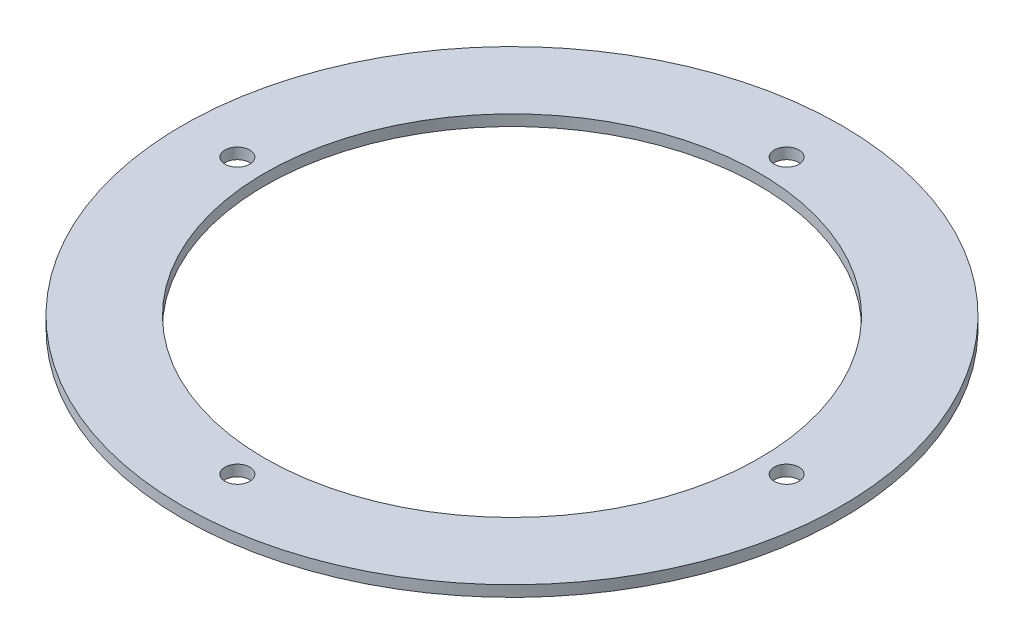
ISO-10303-21;
HEADER;
FILE_DESCRIPTION(('STEP AP214'),'2;1');
FILE_NAME('part.step','',(''),(''),'','','');
FILE_SCHEMA(('AUTOMOTIVE_DESIGN { 1 0 10303 214 1 1 1 1 }'));
ENDSEC;
DATA;
#1=APPLICATION_CONTEXT('core data for automotive mechanical design processes');
#2=APPLICATION_PROTOCOL_DEFINITION('international standard','automotive_design',2000,#1);
#3=PRODUCT_CONTEXT('',#1,'mechanical');
#4=PRODUCT('Part','Part','',(#3));
#5=PRODUCT_RELATED_PRODUCT_CATEGORY('part','',(#4));
#6=PRODUCT_DEFINITION_FORMATION('','',#4);
#7=PRODUCT_DEFINITION_CONTEXT('part definition',#1,'design');
#8=PRODUCT_DEFINITION('design','',#6,#7);
#9=PRODUCT_DEFINITION_SHAPE('','',#8);
#10=(LENGTH_UNIT() NAMED_UNIT(*) SI_UNIT(.MILLI.,.METRE.));
#11=(NAMED_UNIT(*) PLANE_ANGLE_UNIT() SI_UNIT($,.RADIAN.));
#12=(NAMED_UNIT(*) SI_UNIT($,.STERADIAN.) SOLID_ANGLE_UNIT());
#13=UNCERTAINTY_MEASURE_WITH_UNIT(LENGTH_MEASURE(1.E-05),#10,'distance_accuracy_value','');
#14=(GEOMETRIC_REPRESENTATION_CONTEXT(3) GLOBAL_UNCERTAINTY_ASSIGNED_CONTEXT((#13)) GLOBAL_UNIT_ASSIGNED_CONTEXT((#10,
#11,#12)) REPRESENTATION_CONTEXT('',''));
#15=CARTESIAN_POINT('',(0.,0.,0.));
#16=DIRECTION('',(0.,0.,1.));
#17=DIRECTION('',(1.,0.,0.));
#18=AXIS2_PLACEMENT_3D('',#15,#16,#17);
#19=CARTESIAN_POINT('',(0.,2.,0.));
#20=DIRECTION('',(0.,1.,0.));
#21=DIRECTION('',(0.,0.,1.));
#22=AXIS2_PLACEMENT_3D('',#19,#20,#21);
#23=PLANE('',#22);
#24=CARTESIAN_POINT('',(2.82992447504893E-12,2.,50.));
#25=DIRECTION('',(0.,1.,0.));
#26=DIRECTION('',(0.,0.,1.));
#27=AXIS2_PLACEMENT_3D('',#24,#25,#26);
#28=CIRCLE('',#27,2.25000000000304);
#29=CARTESIAN_POINT('',(2.82992447504893E-12,2.,52.250000000003));
#30=VERTEX_POINT('',#29);
#31=EDGE_CURVE('E58',#30,#30,#28,.T.);
#32=ORIENTED_EDGE('',*,*,#31,.F.);
#33=EDGE_LOOP('',(#32));
#34=FACE_BOUND('',#33,.T.);
#35=CARTESIAN_POINT('',(0.,2.,-50.));
#36=DIRECTION('',(0.,1.,0.));
#37=DIRECTION('',(0.,0.,1.));
#38=AXIS2_PLACEMENT_3D('',#35,#36,#37);
#39=CIRCLE('',#38,2.25);
#40=CARTESIAN_POINT('',(0.,2.,-47.75));
#41=VERTEX_POINT('',#40);
#42=EDGE_CURVE('E46',#41,#41,#39,.T.);
#43=ORIENTED_EDGE('',*,*,#42,.F.);
#44=EDGE_LOOP('',(#43));
#45=FACE_BOUND('',#44,.T.);
#46=CARTESIAN_POINT('',(0.,2.,0.));
#47=DIRECTION('',(0.,1.,0.));
#48=DIRECTION('',(0.,0.,1.));
#49=AXIS2_PLACEMENT_3D('',#46,#47,#48);
#50=CIRCLE('',#49,60.);
#51=CARTESIAN_POINT('',(0.,2.,60.));
#52=VERTEX_POINT('',#51);
#53=EDGE_CURVE('E10',#52,#52,#50,.T.);
#54=ORIENTED_EDGE('',*,*,#53,.T.);
#55=EDGE_LOOP('',(#54));
#56=FACE_BOUND('',#55,.T.);
#57=CARTESIAN_POINT('',(0.,2.,0.));
#58=DIRECTION('',(0.,1.,0.));
#59=DIRECTION('',(0.,0.,1.));
#60=AXIS2_PLACEMENT_3D('',#57,#58,#59);
#61=CIRCLE('',#60,45.);
#62=CARTESIAN_POINT('',(0.,2.,45.));
#63=VERTEX_POINT('',#62);
#64=EDGE_CURVE('E41',#63,#63,#61,.T.);
#65=ORIENTED_EDGE('',*,*,#64,.F.);
#66=EDGE_LOOP('',(#65));
#67=FACE_BOUND('',#66,.T.);
#68=CARTESIAN_POINT('',(50.0000000000014,2.,-1.41496223752446E-12));
#69=DIRECTION('',(0.,1.,0.));
#70=DIRECTION('',(0.,0.,1.));
#71=AXIS2_PLACEMENT_3D('',#68,#69,#70);
#72=CIRCLE('',#71,2.25000000000111);
#73=CARTESIAN_POINT('',(50.0000000000014,2.,2.24999999999969));
#74=VERTEX_POINT('',#73);
#75=EDGE_CURVE('E52',#74,#74,#72,.T.);
#76=ORIENTED_EDGE('',*,*,#75,.F.);
#77=EDGE_LOOP('',(#76));
#78=FACE_BOUND('',#77,.T.);
#79=CARTESIAN_POINT('',(-49.9999999999986,2.,1.4210854715202E-12));
#80=DIRECTION('',(0.,1.,0.));
#81=DIRECTION('',(0.,0.,1.));
#82=AXIS2_PLACEMENT_3D('',#79,#80,#81);
#83=CIRCLE('',#82,2.25000000000227);
#84=CARTESIAN_POINT('',(-49.9999999999986,2.,2.25000000000369));
#85=VERTEX_POINT('',#84);
#86=EDGE_CURVE('E64',#85,#85,#83,.T.);
#87=ORIENTED_EDGE('',*,*,#86,.F.);
#88=EDGE_LOOP('',(#87));
#89=FACE_BOUND('',#88,.T.);
#90=ADVANCED_FACE('F30',(#34,#45,#56,#67,#78,#89),#23,.T.);
#91=CARTESIAN_POINT('',(0.,0.,0.));
#92=DIRECTION('',(0.,1.,0.));
#93=DIRECTION('',(0.,0.,1.));
#94=AXIS2_PLACEMENT_3D('',#91,#92,#93);
#95=PLANE('',#94);
#96=CARTESIAN_POINT('',(2.82992447504893E-12,0.,50.));
#97=DIRECTION('',(0.,1.,0.));
#98=DIRECTION('',(0.,0.,1.));
#99=AXIS2_PLACEMENT_3D('',#96,#97,#98);
#100=CIRCLE('',#99,2.25000000000304);
#101=CARTESIAN_POINT('',(2.82992447504893E-12,0.,52.250000000003));
#102=VERTEX_POINT('',#101);
#103=EDGE_CURVE('E61',#102,#102,#100,.T.);
#104=ORIENTED_EDGE('',*,*,#103,.T.);
#105=EDGE_LOOP('',(#104));
#106=FACE_BOUND('',#105,.T.);
#107=CARTESIAN_POINT('',(0.,0.,-50.));
#108=DIRECTION('',(0.,1.,0.));
#109=DIRECTION('',(0.,0.,1.));
#110=AXIS2_PLACEMENT_3D('',#107,#108,#109);
#111=CIRCLE('',#110,2.25);
#112=CARTESIAN_POINT('',(0.,0.,-47.75));
#113=VERTEX_POINT('',#112);
#114=EDGE_CURVE('E49',#113,#113,#111,.T.);
#115=ORIENTED_EDGE('',*,*,#114,.T.);
#116=EDGE_LOOP('',(#115));
#117=FACE_BOUND('',#116,.T.);
#118=CARTESIAN_POINT('',(0.,0.,0.));
#119=DIRECTION('',(0.,1.,0.));
#120=DIRECTION('',(0.,0.,1.));
#121=AXIS2_PLACEMENT_3D('',#118,#119,#120);
#122=CIRCLE('',#121,60.);
#123=CARTESIAN_POINT('',(0.,0.,60.));
#124=VERTEX_POINT('',#123);
#125=EDGE_CURVE('E34',#124,#124,#122,.T.);
#126=ORIENTED_EDGE('',*,*,#125,.F.);
#127=EDGE_LOOP('',(#126));
#128=FACE_BOUND('',#127,.T.);
#129=CARTESIAN_POINT('',(0.,0.,0.));
#130=DIRECTION('',(0.,1.,0.));
#131=DIRECTION('',(0.,0.,1.));
#132=AXIS2_PLACEMENT_3D('',#129,#130,#131);
#133=CIRCLE('',#132,45.);
#134=CARTESIAN_POINT('',(0.,0.,45.));
#135=VERTEX_POINT('',#134);
#136=EDGE_CURVE('E43',#135,#135,#133,.T.);
#137=ORIENTED_EDGE('',*,*,#136,.T.);
#138=EDGE_LOOP('',(#137));
#139=FACE_BOUND('',#138,.T.);
#140=CARTESIAN_POINT('',(50.0000000000014,0.,-1.41496223752446E-12));
#141=DIRECTION('',(0.,1.,0.));
#142=DIRECTION('',(0.,0.,1.));
#143=AXIS2_PLACEMENT_3D('',#140,#141,#142);
#144=CIRCLE('',#143,2.25000000000111);
#145=CARTESIAN_POINT('',(50.0000000000014,0.,2.24999999999969));
#146=VERTEX_POINT('',#145);
#147=EDGE_CURVE('E55',#146,#146,#144,.T.);
#148=ORIENTED_EDGE('',*,*,#147,.T.);
#149=EDGE_LOOP('',(#148));
#150=FACE_BOUND('',#149,.T.);
#151=CARTESIAN_POINT('',(-49.9999999999986,0.,1.4210854715202E-12));
#152=DIRECTION('',(0.,1.,0.));
#153=DIRECTION('',(0.,0.,1.));
#154=AXIS2_PLACEMENT_3D('',#151,#152,#153);
#155=CIRCLE('',#154,2.25000000000227);
#156=CARTESIAN_POINT('',(-49.9999999999986,0.,2.25000000000369));
#157=VERTEX_POINT('',#156);
#158=EDGE_CURVE('E67',#157,#157,#155,.T.);
#159=ORIENTED_EDGE('',*,*,#158,.T.);
#160=EDGE_LOOP('',(#159));
#161=FACE_BOUND('',#160,.T.);
#162=ADVANCED_FACE('F77',(#106,#117,#128,#139,#150,#161),#95,.F.);
#163=CARTESIAN_POINT('',(0.,2.,0.));
#164=DIRECTION('',(0.,-1.,0.));
#165=DIRECTION('',(0.,0.,-1.));
#166=AXIS2_PLACEMENT_3D('',#163,#164,#165);
#167=CYLINDRICAL_SURFACE('',#166,60.);
#168=ORIENTED_EDGE('',*,*,#53,.F.);
#169=EDGE_LOOP('',(#168));
#170=FACE_BOUND('',#169,.T.);
#171=ORIENTED_EDGE('',*,*,#125,.T.);
#172=EDGE_LOOP('',(#171));
#173=FACE_BOUND('',#172,.T.);
#174=ADVANCED_FACE('F32',(#170,#173),#167,.T.);
#175=CARTESIAN_POINT('',(0.,2.,0.));
#176=DIRECTION('',(0.,-1.,0.));
#177=DIRECTION('',(0.,0.,-1.));
#178=AXIS2_PLACEMENT_3D('',#175,#176,#177);
#179=CYLINDRICAL_SURFACE('',#178,45.);
#180=ORIENTED_EDGE('',*,*,#64,.T.);
#181=EDGE_LOOP('',(#180));
#182=FACE_BOUND('',#181,.T.);
#183=ORIENTED_EDGE('',*,*,#136,.F.);
#184=EDGE_LOOP('',(#183));
#185=FACE_BOUND('',#184,.T.);
#186=ADVANCED_FACE('F87',(#182,#185),#179,.F.);
#187=CARTESIAN_POINT('',(0.,2.,-50.));
#188=DIRECTION('',(0.,-1.,0.));
#189=DIRECTION('',(0.,0.,-1.));
#190=AXIS2_PLACEMENT_3D('',#187,#188,#189);
#191=CYLINDRICAL_SURFACE('',#190,2.25);
#192=ORIENTED_EDGE('',*,*,#42,.T.);
#193=EDGE_LOOP('',(#192));
#194=FACE_BOUND('',#193,.T.);
#195=ORIENTED_EDGE('',*,*,#114,.F.);
#196=EDGE_LOOP('',(#195));
#197=FACE_BOUND('',#196,.T.);
#198=ADVANCED_FACE('F90',(#194,#197),#191,.F.);
#199=CARTESIAN_POINT('',(50.0000000000014,2.,-1.41496223752446E-12));
#200=DIRECTION('',(0.,-1.,0.));
#201=DIRECTION('',(0.,0.,-1.));
#202=AXIS2_PLACEMENT_3D('',#199,#200,#201);
#203=CYLINDRICAL_SURFACE('',#202,2.25000000000111);
#204=ORIENTED_EDGE('',*,*,#75,.T.);
#205=EDGE_LOOP('',(#204));
#206=FACE_BOUND('',#205,.T.);
#207=ORIENTED_EDGE('',*,*,#147,.F.);
#208=EDGE_LOOP('',(#207));
#209=FACE_BOUND('',#208,.T.);
#210=ADVANCED_FACE('F94',(#206,#209),#203,.F.);
#211=CARTESIAN_POINT('',(2.82992447504893E-12,2.,50.));
#212=DIRECTION('',(0.,-1.,0.));
#213=DIRECTION('',(0.,0.,-1.));
#214=AXIS2_PLACEMENT_3D('',#211,#212,#213);
#215=CYLINDRICAL_SURFACE('',#214,2.25000000000304);
#216=ORIENTED_EDGE('',*,*,#31,.T.);
#217=EDGE_LOOP('',(#216));
#218=FACE_BOUND('',#217,.T.);
#219=ORIENTED_EDGE('',*,*,#103,.F.);
#220=EDGE_LOOP('',(#219));
#221=FACE_BOUND('',#220,.T.);
#222=ADVANCED_FACE('F98',(#218,#221),#215,.F.);
#223=CARTESIAN_POINT('',(-49.9999999999986,2.,1.4210854715202E-12));
#224=DIRECTION('',(0.,-1.,0.));
#225=DIRECTION('',(0.,0.,-1.));
#226=AXIS2_PLACEMENT_3D('',#223,#224,#225);
#227=CYLINDRICAL_SURFACE('',#226,2.25000000000227);
#228=ORIENTED_EDGE('',*,*,#86,.T.);
#229=EDGE_LOOP('',(#228));
#230=FACE_BOUND('',#229,.T.);
#231=ORIENTED_EDGE('',*,*,#158,.F.);
#232=EDGE_LOOP('',(#231));
#233=FACE_BOUND('',#232,.T.);
#234=ADVANCED_FACE('F73',(#230,#233),#227,.F.);
#235=CLOSED_SHELL('',(#90,#162,#174,#186,#198,#210,#222,#234));
#236=MANIFOLD_SOLID_BREP('B2',#235);
#237=ADVANCED_BREP_SHAPE_REPRESENTATION('',(#18,#236),#14);
#238=SHAPE_DEFINITION_REPRESENTATION(#9,#237);
ENDSEC;
END-ISO-10303-21;
